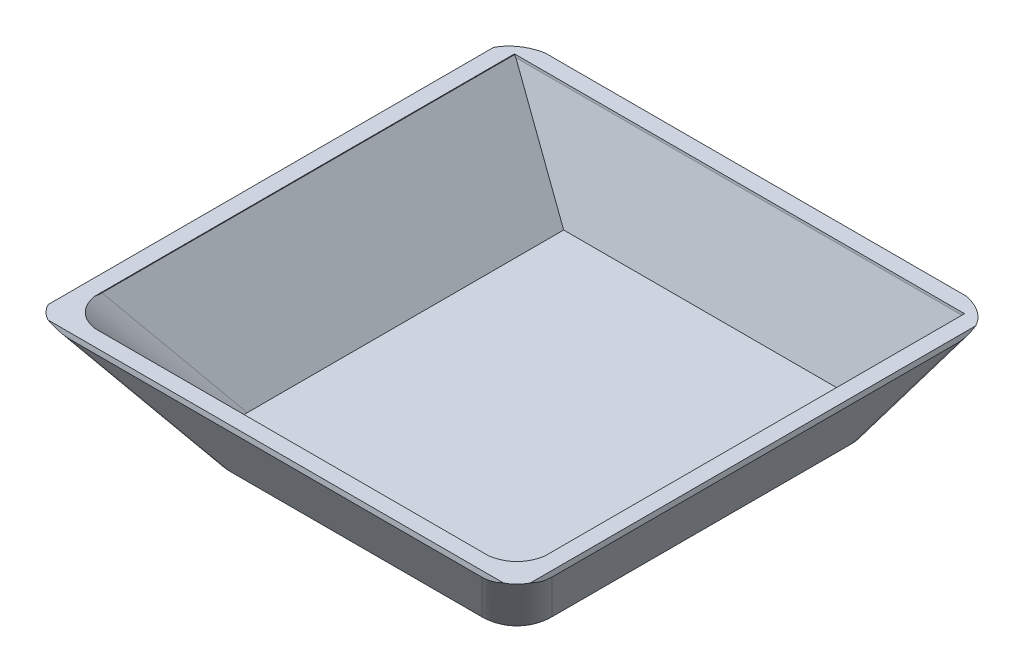
ISO-10303-21;
HEADER;
FILE_DESCRIPTION(('STEP AP214'),'2;1');
FILE_NAME('part.step','',(''),(''),'','','');
FILE_SCHEMA(('AUTOMOTIVE_DESIGN { 1 0 10303 214 1 1 1 1 }'));
ENDSEC;
DATA;
#1=APPLICATION_CONTEXT('core data for automotive mechanical design processes');
#2=APPLICATION_PROTOCOL_DEFINITION('international standard','automotive_design',2000,#1);
#3=PRODUCT_CONTEXT('',#1,'mechanical');
#4=PRODUCT('Part','Part','',(#3));
#5=PRODUCT_RELATED_PRODUCT_CATEGORY('part','',(#4));
#6=PRODUCT_DEFINITION_FORMATION('','',#4);
#7=PRODUCT_DEFINITION_CONTEXT('part definition',#1,'design');
#8=PRODUCT_DEFINITION('design','',#6,#7);
#9=PRODUCT_DEFINITION_SHAPE('','',#8);
#10=(LENGTH_UNIT() NAMED_UNIT(*) SI_UNIT(.MILLI.,.METRE.));
#11=(NAMED_UNIT(*) PLANE_ANGLE_UNIT() SI_UNIT($,.RADIAN.));
#12=(NAMED_UNIT(*) SI_UNIT($,.STERADIAN.) SOLID_ANGLE_UNIT());
#13=UNCERTAINTY_MEASURE_WITH_UNIT(LENGTH_MEASURE(1.E-05),#10,'distance_accuracy_value','');
#14=(GEOMETRIC_REPRESENTATION_CONTEXT(3) GLOBAL_UNCERTAINTY_ASSIGNED_CONTEXT((#13)) GLOBAL_UNIT_ASSIGNED_CONTEXT((#10,
#11,#12)) REPRESENTATION_CONTEXT('',''));
#15=CARTESIAN_POINT('',(0.,0.,0.));
#16=DIRECTION('',(0.,0.,1.));
#17=DIRECTION('',(1.,0.,0.));
#18=AXIS2_PLACEMENT_3D('',#15,#16,#17);
#19=CARTESIAN_POINT('',(0.,0.,0.));
#20=DIRECTION('',(0.,1.,0.));
#21=DIRECTION('',(0.,0.,1.));
#22=AXIS2_PLACEMENT_3D('',#19,#20,#21);
#23=PLANE('',#22);
#24=DIRECTION('',(0.,0.,1.));
#25=VECTOR('',#24,1.);
#26=CARTESIAN_POINT('',(-33.8077003392964,0.,-4.84582776302726));
#27=LINE('',#26,#25);
#28=CARTESIAN_POINT('',(-33.8077003392964,0.,-20.32561407749));
#29=VERTEX_POINT('',#28);
#30=CARTESIAN_POINT('',(-33.8077003392964,0.,-9.15647103388965));
#31=VERTEX_POINT('',#30);
#32=EDGE_CURVE('E272',#29,#31,#27,.T.);
#33=ORIENTED_EDGE('',*,*,#32,.T.);
#34=CARTESIAN_POINT('',(-35.7609396813148,0.,-9.7990671050456));
#35=DIRECTION('',(0.,1.,0.));
#36=DIRECTION('',(0.707106781186547,0.,0.707106781186548));
#37=AXIS2_PLACEMENT_3D('',#34,#35,#36);
#38=ELLIPSE('',#37,2.25172996924951,1.6);
#39=CARTESIAN_POINT('',(-35.1183436101588,0.,-7.84582776302727));
#40=VERTEX_POINT('',#39);
#41=EDGE_CURVE('E299',#31,#40,#38,.F.);
#42=ORIENTED_EDGE('',*,*,#41,.T.);
#43=DIRECTION('',(-1.,0.,0.));
#44=VECTOR('',#43,1.);
#45=CARTESIAN_POINT('',(0.,0.,-7.84582776302727));
#46=LINE('',#45,#44);
#47=CARTESIAN_POINT('',(-44.4970570684341,0.,-7.84582776302727));
#48=VERTEX_POINT('',#47);
#49=EDGE_CURVE('E269',#40,#48,#46,.T.);
#50=ORIENTED_EDGE('',*,*,#49,.T.);
#51=CARTESIAN_POINT('',(-43.8544609972781,0.,-9.7990671050456));
#52=DIRECTION('',(0.,1.,0.));
#53=DIRECTION('',(-0.707106781186547,0.,0.707106781186548));
#54=AXIS2_PLACEMENT_3D('',#51,#52,#53);
#55=ELLIPSE('',#54,2.25172996924951,1.6);
#56=CARTESIAN_POINT('',(-45.8077003392964,0.,-9.15647103388965));
#57=VERTEX_POINT('',#56);
#58=EDGE_CURVE('E297',#48,#57,#55,.F.);
#59=ORIENTED_EDGE('',*,*,#58,.T.);
#60=DIRECTION('',(0.,0.,1.));
#61=VECTOR('',#60,1.);
#62=CARTESIAN_POINT('',(-45.8077003392964,0.,-4.84582776302726));
#63=LINE('',#62,#61);
#64=CARTESIAN_POINT('',(-45.8077003392964,0.,-20.32561407749));
#65=VERTEX_POINT('',#64);
#66=EDGE_CURVE('E216',#65,#57,#63,.T.);
#67=ORIENTED_EDGE('',*,*,#66,.F.);
#68=CARTESIAN_POINT('',(-43.8544609972781,0.,-20.1137411905578));
#69=DIRECTION('',(0.,1.,0.));
#70=DIRECTION('',(-0.949709463562377,0.,-0.313132455711736));
#71=AXIS2_PLACEMENT_3D('',#68,#69,#70);
#72=ELLIPSE('',#71,1.98786122219148,1.6);
#73=CARTESIAN_POINT('',(-44.1064808756458,0.,-21.7558277630273));
#74=VERTEX_POINT('',#73);
#75=EDGE_CURVE('E295',#65,#74,#72,.F.);
#76=ORIENTED_EDGE('',*,*,#75,.T.);
#77=DIRECTION('',(1.,0.,0.));
#78=VECTOR('',#77,1.);
#79=CARTESIAN_POINT('',(-33.8077003392964,0.,-21.7558277630273));
#80=LINE('',#79,#78);
#81=CARTESIAN_POINT('',(-35.5089198029471,0.,-21.7558277630273));
#82=VERTEX_POINT('',#81);
#83=EDGE_CURVE('E281',#74,#82,#80,.T.);
#84=ORIENTED_EDGE('',*,*,#83,.T.);
#85=CARTESIAN_POINT('',(-35.7609396813148,0.,-20.1137411905578));
#86=DIRECTION('',(0.,1.,0.));
#87=DIRECTION('',(0.949709463562377,0.,-0.313132455711736));
#88=AXIS2_PLACEMENT_3D('',#85,#86,#87);
#89=ELLIPSE('',#88,1.98786122219148,1.6);
#90=EDGE_CURVE('E293',#82,#29,#89,.F.);
#91=ORIENTED_EDGE('',*,*,#90,.T.);
#92=EDGE_LOOP('',(#33,#42,#50,#59,#67,#76,#84,#91));
#93=FACE_BOUND('',#92,.T.);
#94=ADVANCED_FACE('F46',(#93),#23,.F.);
#95=CARTESIAN_POINT('',(-39.8077003392964,4.5,-22.7558277630273));
#96=DIRECTION('',(0.,0.,-1.));
#97=DIRECTION('',(-1.,0.,0.));
#98=AXIS2_PLACEMENT_3D('',#95,#96,#97);
#99=PLANE('',#98);
#100=DIRECTION('',(-1.,0.,0.));
#101=VECTOR('',#100,1.);
#102=CARTESIAN_POINT('',(-39.8077003392964,4.33147587428414,-22.7558277630273));
#103=LINE('',#102,#101);
#104=CARTESIAN_POINT('',(-32.4759877441998,4.33147587428414,-22.7558277630273));
#105=VERTEX_POINT('',#104);
#106=CARTESIAN_POINT('',(-47.139412934393,4.33147587428414,-22.7558277630273));
#107=VERTEX_POINT('',#106);
#108=EDGE_CURVE('E284',#105,#107,#103,.T.);
#109=ORIENTED_EDGE('',*,*,#108,.T.);
#110=CARTESIAN_POINT('',(-51.8677300649063,11.4441342464214,-22.7558277630273));
#111=DIRECTION('',(0.,0.,-1.));
#112=DIRECTION('',(-0.573576436351047,0.819152044288991,0.));
#113=AXIS2_PLACEMENT_3D('',#110,#111,#112);
#114=ELLIPSE('',#113,8.61037292534736,1.6);
#115=CARTESIAN_POINT('',(-47.6705768892428,4.5,-22.7558277630273));
#116=VERTEX_POINT('',#115);
#117=EDGE_CURVE('E337',#107,#116,#114,.T.);
#118=ORIENTED_EDGE('',*,*,#117,.T.);
#119=DIRECTION('',(1.,0.,0.));
#120=VECTOR('',#119,1.);
#121=CARTESIAN_POINT('',(-39.8077003392964,4.5,-22.7558277630273));
#122=LINE('',#121,#120);
#123=CARTESIAN_POINT('',(-31.9448237893501,4.5,-22.7558277630273));
#124=VERTEX_POINT('',#123);
#125=EDGE_CURVE('E266',#116,#124,#122,.T.);
#126=ORIENTED_EDGE('',*,*,#125,.T.);
#127=CARTESIAN_POINT('',(-27.7476706136866,11.4441342464214,-22.7558277630273));
#128=DIRECTION('',(0.,0.,-1.));
#129=DIRECTION('',(0.573576436351047,0.819152044288991,0.));
#130=AXIS2_PLACEMENT_3D('',#127,#128,#129);
#131=ELLIPSE('',#130,8.61037292534736,1.6);
#132=EDGE_CURVE('E335',#124,#105,#131,.T.);
#133=ORIENTED_EDGE('',*,*,#132,.T.);
#134=EDGE_LOOP('',(#109,#118,#126,#133));
#135=FACE_BOUND('',#134,.T.);
#136=ADVANCED_FACE('F392',(#135),#99,.T.);
#137=CARTESIAN_POINT('',(-30.8077003392964,4.5,-22.7558277630273));
#138=DIRECTION('',(1.,0.,0.));
#139=DIRECTION('',(0.,0.,-1.));
#140=AXIS2_PLACEMENT_3D('',#137,#138,#139);
#141=PLANE('',#140);
#142=DIRECTION('',(0.,0.,1.));
#143=VECTOR('',#142,1.);
#144=CARTESIAN_POINT('',(-30.8077003392964,4.5,-22.7558277630273));
#145=LINE('',#144,#143);
#146=CARTESIAN_POINT('',(-30.8077003392964,4.5,-21.9758095647512));
#147=VERTEX_POINT('',#146);
#148=CARTESIAN_POINT('',(-30.8077003392964,4.5,-5.34421632265923));
#149=VERTEX_POINT('',#148);
#150=EDGE_CURVE('E263',#147,#149,#145,.T.);
#151=ORIENTED_EDGE('',*,*,#150,.T.);
#152=CARTESIAN_POINT('',(-30.8077003392964,7.0739588932201,-4.84582776302726));
#153=DIRECTION('',(1.,0.,0.));
#154=DIRECTION('',(0.,0.819152044288991,0.573576436351047));
#155=AXIS2_PLACEMENT_3D('',#152,#153,#154);
#156=ELLIPSE('',#155,3.21580366730517,1.6);
#157=CARTESIAN_POINT('',(-30.8077003392964,4.28444402022634,-6.15647103388965));
#158=VERTEX_POINT('',#157);
#159=EDGE_CURVE('E320',#149,#158,#156,.T.);
#160=ORIENTED_EDGE('',*,*,#159,.T.);
#161=DIRECTION('',(0.,0.,-1.));
#162=VECTOR('',#161,1.);
#163=CARTESIAN_POINT('',(-30.8077003392964,4.28444402022634,-22.7558277630273));
#164=LINE('',#163,#162);
#165=CARTESIAN_POINT('',(-30.8077003392964,4.28444402022634,-21.3147559184184));
#166=VERTEX_POINT('',#165);
#167=EDGE_CURVE('E275',#158,#166,#164,.T.);
#168=ORIENTED_EDGE('',*,*,#167,.T.);
#169=CARTESIAN_POINT('',(-30.8077003392964,7.0739588932201,-21.7468932843322));
#170=DIRECTION('',(1.,0.,0.));
#171=DIRECTION('',(0.,0.974370064785235,-0.224951054343866));
#172=AXIS2_PLACEMENT_3D('',#169,#170,#171);
#173=ELLIPSE('',#172,2.8389600421527,1.6);
#174=EDGE_CURVE('E318',#166,#147,#173,.T.);
#175=ORIENTED_EDGE('',*,*,#174,.T.);
#176=EDGE_LOOP('',(#151,#160,#168,#175));
#177=FACE_BOUND('',#176,.T.);
#178=ADVANCED_FACE('F398',(#177),#141,.T.);
#179=CARTESIAN_POINT('',(-39.8077003392964,4.5,-4.84582776302726));
#180=DIRECTION('',(0.,0.,-1.));
#181=DIRECTION('',(-1.,0.,0.));
#182=AXIS2_PLACEMENT_3D('',#179,#180,#181);
#183=PLANE('',#182);
#184=DIRECTION('',(1.,0.,0.));
#185=VECTOR('',#184,1.);
#186=CARTESIAN_POINT('',(-39.8077003392964,4.28444402022634,-4.84582776302726));
#187=LINE('',#186,#185);
#188=CARTESIAN_POINT('',(-47.4970570684341,4.28444402022634,-4.84582776302726));
#189=VERTEX_POINT('',#188);
#190=CARTESIAN_POINT('',(-32.1183436101588,4.28444402022634,-4.84582776302726));
#191=VERTEX_POINT('',#190);
#192=EDGE_CURVE('E278',#189,#191,#187,.T.);
#193=ORIENTED_EDGE('',*,*,#192,.T.);
#194=CARTESIAN_POINT('',(-30.8077003392964,7.07395889322009,-4.84582776302726));
#195=DIRECTION('',(0.,0.,-1.));
#196=DIRECTION('',(0.573576436351047,0.819152044288991,0.));
#197=AXIS2_PLACEMENT_3D('',#194,#195,#196);
#198=ELLIPSE('',#197,3.21580366730517,1.6);
#199=CARTESIAN_POINT('',(-31.3060888989284,4.5,-4.84582776302726));
#200=VERTEX_POINT('',#199);
#201=EDGE_CURVE('E308',#191,#200,#198,.F.);
#202=ORIENTED_EDGE('',*,*,#201,.T.);
#203=DIRECTION('',(1.,0.,0.));
#204=VECTOR('',#203,1.);
#205=CARTESIAN_POINT('',(-39.8077003392964,4.5,-4.84582776302726));
#206=LINE('',#205,#204);
#207=CARTESIAN_POINT('',(-48.3093117796645,4.5,-4.84582776302726));
#208=VERTEX_POINT('',#207);
#209=EDGE_CURVE('E260',#208,#200,#206,.T.);
#210=ORIENTED_EDGE('',*,*,#209,.F.);
#211=CARTESIAN_POINT('',(-48.8077003392964,7.07395889322009,-4.84582776302726));
#212=DIRECTION('',(0.,0.,-1.));
#213=DIRECTION('',(-0.573576436351047,0.819152044288991,0.));
#214=AXIS2_PLACEMENT_3D('',#211,#212,#213);
#215=ELLIPSE('',#214,3.21580366730517,1.6);
#216=EDGE_CURVE('E306',#208,#189,#215,.F.);
#217=ORIENTED_EDGE('',*,*,#216,.T.);
#218=EDGE_LOOP('',(#193,#202,#210,#217));
#219=FACE_BOUND('',#218,.T.);
#220=ADVANCED_FACE('F403',(#219),#183,.F.);
#221=CARTESIAN_POINT('',(0.,4.5,0.));
#222=DIRECTION('',(0.,-1.,0.));
#223=DIRECTION('',(0.,0.,-1.));
#224=AXIS2_PLACEMENT_3D('',#221,#222,#223);
#225=PLANE('',#224);
#226=ORIENTED_EDGE('',*,*,#209,.T.);
#227=CARTESIAN_POINT('',(-32.6100057593711,4.5,-6.6481331831019));
#228=DIRECTION('',(0.,-1.,0.));
#229=DIRECTION('',(0.707106781186547,0.,0.707106781186548));
#230=AXIS2_PLACEMENT_3D('',#227,#228,#229);
#231=ELLIPSE('',#230,2.25172996924951,1.6);
#232=EDGE_CURVE('E316',#200,#149,#231,.F.);
#233=ORIENTED_EDGE('',*,*,#232,.T.);
#234=ORIENTED_EDGE('',*,*,#150,.F.);
#235=CARTESIAN_POINT('',(-32.6100057593711,4.5,-21.1526480506229));
#236=DIRECTION('',(0.,-1.,0.));
#237=DIRECTION('',(0.949709463562377,0.,-0.313132455711736));
#238=AXIS2_PLACEMENT_3D('',#235,#236,#237);
#239=ELLIPSE('',#238,1.98786122219148,1.6);
#240=EDGE_CURVE('E310',#147,#124,#239,.F.);
#241=ORIENTED_EDGE('',*,*,#240,.T.);
#242=ORIENTED_EDGE('',*,*,#125,.F.);
#243=CARTESIAN_POINT('',(-47.0053949192218,4.5,-21.1526480506229));
#244=DIRECTION('',(0.,-1.,0.));
#245=DIRECTION('',(-0.949709463562377,0.,-0.313132455711736));
#246=AXIS2_PLACEMENT_3D('',#243,#244,#245);
#247=ELLIPSE('',#246,1.98786122219148,1.6);
#248=CARTESIAN_POINT('',(-48.8077003392964,4.5,-21.9758095647512));
#249=VERTEX_POINT('',#248);
#250=EDGE_CURVE('E312',#116,#249,#247,.F.);
#251=ORIENTED_EDGE('',*,*,#250,.T.);
#252=DIRECTION('',(0.,0.,1.));
#253=VECTOR('',#252,1.);
#254=CARTESIAN_POINT('',(-48.8077003392964,4.5,-22.7558277630273));
#255=LINE('',#254,#253);
#256=CARTESIAN_POINT('',(-48.8077003392964,4.5,-5.3442163226592));
#257=VERTEX_POINT('',#256);
#258=EDGE_CURVE('E727',#249,#257,#255,.T.);
#259=ORIENTED_EDGE('',*,*,#258,.T.);
#260=CARTESIAN_POINT('',(-47.0053949192218,4.5,-6.6481331831019));
#261=DIRECTION('',(0.,-1.,0.));
#262=DIRECTION('',(-0.707106781186547,0.,0.707106781186548));
#263=AXIS2_PLACEMENT_3D('',#260,#261,#262);
#264=ELLIPSE('',#263,2.25172996924951,1.6);
#265=EDGE_CURVE('E314',#257,#208,#264,.F.);
#266=ORIENTED_EDGE('',*,*,#265,.T.);
#267=EDGE_LOOP('',(#226,#233,#234,#241,#242,#251,#259,#266));
#268=FACE_BOUND('',#267,.T.);
#269=DIRECTION('',(1.,0.,0.));
#270=VECTOR('',#269,1.);
#271=CARTESIAN_POINT('',(0.,4.5,-5.44582776302726));
#272=LINE('',#271,#270);
#273=CARTESIAN_POINT('',(-47.1625037701931,4.5,-5.44582776302726));
#274=VERTEX_POINT('',#273);
#275=CARTESIAN_POINT('',(-32.4528969083996,4.5,-5.44582776302726));
#276=VERTEX_POINT('',#275);
#277=EDGE_CURVE('E235',#274,#276,#272,.T.);
#278=ORIENTED_EDGE('',*,*,#277,.F.);
#279=CARTESIAN_POINT('',(-46.2729301659649,4.5,-7.38059793635877));
#280=DIRECTION('',(0.,-1.,0.));
#281=DIRECTION('',(0.707106781186547,0.,-0.707106781186548));
#282=AXIS2_PLACEMENT_3D('',#279,#280,#281);
#283=ELLIPSE('',#282,2.25172996924951,1.6);
#284=CARTESIAN_POINT('',(-48.2077003392964,4.5,-6.49102433213043));
#285=VERTEX_POINT('',#284);
#286=EDGE_CURVE('E54',#274,#285,#283,.T.);
#287=ORIENTED_EDGE('',*,*,#286,.T.);
#288=DIRECTION('',(0.,0.,1.));
#289=VECTOR('',#288,1.);
#290=CARTESIAN_POINT('',(-48.2077003392964,4.5,0.));
#291=LINE('',#290,#289);
#292=CARTESIAN_POINT('',(-48.2077003392964,4.5,-22.1558277630273));
#293=VERTEX_POINT('',#292);
#294=EDGE_CURVE('E230',#293,#285,#291,.T.);
#295=ORIENTED_EDGE('',*,*,#294,.F.);
#296=DIRECTION('',(1.,0.,0.));
#297=VECTOR('',#296,1.);
#298=CARTESIAN_POINT('',(0.,4.5,-22.1558277630273));
#299=LINE('',#298,#297);
#300=CARTESIAN_POINT('',(-31.4077003392964,4.5,-22.1558277630273));
#301=VERTEX_POINT('',#300);
#302=EDGE_CURVE('E248',#293,#301,#299,.T.);
#303=ORIENTED_EDGE('',*,*,#302,.T.);
#304=DIRECTION('',(0.,0.,1.));
#305=VECTOR('',#304,1.);
#306=CARTESIAN_POINT('',(-31.4077003392964,4.5,0.));
#307=LINE('',#306,#305);
#308=CARTESIAN_POINT('',(-31.4077003392964,4.5,-6.4910243321304));
#309=VERTEX_POINT('',#308);
#310=EDGE_CURVE('E254',#301,#309,#307,.T.);
#311=ORIENTED_EDGE('',*,*,#310,.T.);
#312=CARTESIAN_POINT('',(-33.3424705126279,4.5,-7.38059793635877));
#313=DIRECTION('',(0.,-1.,0.));
#314=DIRECTION('',(-0.707106781186547,0.,-0.707106781186548));
#315=AXIS2_PLACEMENT_3D('',#312,#313,#314);
#316=ELLIPSE('',#315,2.25172996924951,1.6);
#317=EDGE_CURVE('E11',#309,#276,#316,.T.);
#318=ORIENTED_EDGE('',*,*,#317,.T.);
#319=EDGE_LOOP('',(#278,#287,#295,#303,#311,#318));
#320=FACE_BOUND('',#319,.T.);
#321=ADVANCED_FACE('F360',(#268,#320),#225,.F.);
#322=CARTESIAN_POINT('',(-39.8077003392964,4.28444402022634,-4.84582776302726));
#323=DIRECTION('',(0.,0.573576436351047,-0.819152044288991));
#324=DIRECTION('',(1.,0.,0.));
#325=AXIS2_PLACEMENT_3D('',#322,#323,#324);
#326=PLANE('',#325);
#327=ORIENTED_EDGE('',*,*,#49,.F.);
#328=DIRECTION('',(-0.497542812164524,-0.710564775461629,-0.497542812164524));
#329=VECTOR('',#328,1.);
#330=CARTESIAN_POINT('',(-34.021835025209,1.56597654997177,-6.7493191780774));
#331=LINE('',#330,#329);
#332=EDGE_CURVE('E304',#40,#191,#331,.F.);
#333=ORIENTED_EDGE('',*,*,#332,.T.);
#334=ORIENTED_EDGE('',*,*,#192,.F.);
#335=DIRECTION('',(0.497542812164524,-0.710564775461629,-0.497542812164524));
#336=VECTOR('',#335,1.);
#337=CARTESIAN_POINT('',(-45.5935656533839,1.56597654997177,-6.7493191780774));
#338=LINE('',#337,#336);
#339=EDGE_CURVE('E301',#189,#48,#338,.T.);
#340=ORIENTED_EDGE('',*,*,#339,.T.);
#341=EDGE_LOOP('',(#327,#333,#334,#340));
#342=FACE_BOUND('',#341,.T.);
#343=ADVANCED_FACE('F414',(#342),#326,.F.);
#344=CARTESIAN_POINT('',(-33.8077003392964,0.,0.));
#345=DIRECTION('',(0.819152044288991,-0.573576436351047,0.));
#346=DIRECTION('',(0.,0.,-1.));
#347=AXIS2_PLACEMENT_3D('',#344,#345,#346);
#348=PLANE('',#347);
#349=ORIENTED_EDGE('',*,*,#167,.F.);
#350=DIRECTION('',(0.497542812164523,0.710564775461629,0.497542812164524));
#351=VECTOR('',#350,1.);
#352=CARTESIAN_POINT('',(-31.5410264653794,3.237145774969,-6.88979715997264));
#353=LINE('',#352,#351);
#354=EDGE_CURVE('E290',#158,#31,#353,.F.);
#355=ORIENTED_EDGE('',*,*,#354,.T.);
#356=ORIENTED_EDGE('',*,*,#32,.F.);
#357=DIRECTION('',(0.563586657171395,0.804885161065777,-0.185822381199064));
#358=VECTOR('',#357,1.);
#359=CARTESIAN_POINT('',(-35.9363412225114,-3.0400142344332,-19.6237714901905));
#360=LINE('',#359,#358);
#361=EDGE_CURVE('E287',#29,#166,#360,.T.);
#362=ORIENTED_EDGE('',*,*,#361,.T.);
#363=EDGE_LOOP('',(#349,#355,#356,#362));
#364=FACE_BOUND('',#363,.T.);
#365=ADVANCED_FACE('F406',(#364),#348,.T.);
#366=CARTESIAN_POINT('',(0.,0.,-21.7558277630273));
#367=DIRECTION('',(0.,-0.224951054343866,-0.974370064785235));
#368=DIRECTION('',(-1.,0.,0.));
#369=AXIS2_PLACEMENT_3D('',#366,#367,#368);
#370=PLANE('',#369);
#371=ORIENTED_EDGE('',*,*,#83,.F.);
#372=DIRECTION('',(-0.563586657171395,0.804885161065778,-0.185822381199064));
#373=VECTOR('',#372,1.);
#374=CARTESIAN_POINT('',(-30.0969428773862,-20.0076937675923,-17.136687694309));
#375=LINE('',#374,#373);
#376=EDGE_CURVE('E332',#74,#107,#375,.T.);
#377=ORIENTED_EDGE('',*,*,#376,.T.);
#378=ORIENTED_EDGE('',*,*,#108,.F.);
#379=DIRECTION('',(0.563586657171395,0.804885161065778,-0.185822381199064));
#380=VECTOR('',#379,1.);
#381=CARTESIAN_POINT('',(-24.2302244416216,16.1076462989286,-25.4745709273513));
#382=LINE('',#381,#380);
#383=EDGE_CURVE('E330',#105,#82,#382,.F.);
#384=ORIENTED_EDGE('',*,*,#383,.T.);
#385=EDGE_LOOP('',(#371,#377,#378,#384));
#386=FACE_BOUND('',#385,.T.);
#387=ADVANCED_FACE('F413',(#386),#370,.T.);
#388=CARTESIAN_POINT('',(0.,0.6,0.));
#389=DIRECTION('',(0.,1.,0.));
#390=DIRECTION('',(0.,0.,1.));
#391=AXIS2_PLACEMENT_3D('',#388,#389,#390);
#392=PLANE('',#391);
#393=DIRECTION('',(0.,0.,1.));
#394=VECTOR('',#393,1.);
#395=CARTESIAN_POINT('',(-45.4953601089654,0.6,0.));
#396=LINE('',#395,#394);
#397=CARTESIAN_POINT('',(-45.4953601089654,0.6,-21.2785662130266));
#398=VERTEX_POINT('',#397);
#399=CARTESIAN_POINT('',(-45.4953601089654,0.6,-9.4688112642207));
#400=VERTEX_POINT('',#399);
#401=EDGE_CURVE('E201',#398,#400,#396,.T.);
#402=ORIENTED_EDGE('',*,*,#401,.T.);
#403=CARTESIAN_POINT('',(-43.5421207669471,0.6,-10.1114073353766));
#404=DIRECTION('',(0.,1.,0.));
#405=DIRECTION('',(0.707106781186547,0.,-0.707106781186548));
#406=AXIS2_PLACEMENT_3D('',#403,#404,#405);
#407=ELLIPSE('',#406,2.25172996924951,1.6);
#408=CARTESIAN_POINT('',(-44.184716838103,0.6,-8.15816799335831));
#409=VERTEX_POINT('',#408);
#410=EDGE_CURVE('E342',#400,#409,#407,.T.);
#411=ORIENTED_EDGE('',*,*,#410,.T.);
#412=DIRECTION('',(1.,0.,0.));
#413=VECTOR('',#412,1.);
#414=CARTESIAN_POINT('',(-39.8077003392964,0.6,-8.15816799335831));
#415=LINE('',#414,#413);
#416=CARTESIAN_POINT('',(-35.4306838404899,0.6,-8.15816799335831));
#417=VERTEX_POINT('',#416);
#418=EDGE_CURVE('E239',#417,#409,#415,.F.);
#419=ORIENTED_EDGE('',*,*,#418,.F.);
#420=CARTESIAN_POINT('',(-36.0732799116458,0.6,-10.1114073353766));
#421=DIRECTION('',(0.,1.,0.));
#422=DIRECTION('',(-0.707106781186547,0.,-0.707106781186548));
#423=AXIS2_PLACEMENT_3D('',#420,#421,#422);
#424=ELLIPSE('',#423,2.25172996924951,1.6);
#425=CARTESIAN_POINT('',(-34.1200405696275,0.6,-9.4688112642207));
#426=VERTEX_POINT('',#425);
#427=EDGE_CURVE('E340',#417,#426,#424,.T.);
#428=ORIENTED_EDGE('',*,*,#427,.T.);
#429=DIRECTION('',(0.,0.,1.));
#430=VECTOR('',#429,1.);
#431=CARTESIAN_POINT('',(-34.1200405696275,0.6,0.));
#432=LINE('',#431,#430);
#433=CARTESIAN_POINT('',(-34.1200405696275,0.6,-21.2785662130266));
#434=VERTEX_POINT('',#433);
#435=EDGE_CURVE('E202',#434,#426,#432,.T.);
#436=ORIENTED_EDGE('',*,*,#435,.F.);
#437=DIRECTION('',(1.,0.,0.));
#438=VECTOR('',#437,1.);
#439=CARTESIAN_POINT('',(0.,0.6,-21.2785662130266));
#440=LINE('',#439,#438);
#441=EDGE_CURVE('E197',#398,#434,#440,.T.);
#442=ORIENTED_EDGE('',*,*,#441,.F.);
#443=EDGE_LOOP('',(#402,#411,#419,#428,#436,#442));
#444=FACE_BOUND('',#443,.T.);
#445=ADVANCED_FACE('F199',(#444),#392,.T.);
#446=CARTESIAN_POINT('',(-39.8077003392964,4.5,-22.1558277630273));
#447=DIRECTION('',(0.,0.,-1.));
#448=DIRECTION('',(-1.,0.,0.));
#449=AXIS2_PLACEMENT_3D('',#446,#447,#448);
#450=PLANE('',#449);
#451=DIRECTION('',(0.573576436351047,0.819152044288991,0.));
#452=VECTOR('',#451,1.);
#453=CARTESIAN_POINT('',(-34.2991915658698,0.344145861810628,-22.1558277630273));
#454=LINE('',#453,#452);
#455=CARTESIAN_POINT('',(-31.4593658907241,4.39983723926513,-22.1558277630273));
#456=VERTEX_POINT('',#455);
#457=CARTESIAN_POINT('',(-31.4077003392964,4.47362329355373,-22.1558277630273));
#458=VERTEX_POINT('',#457);
#459=EDGE_CURVE('E250',#456,#458,#454,.T.);
#460=ORIENTED_EDGE('',*,*,#459,.T.);
#461=DIRECTION('',(0.,-1.,0.));
#462=VECTOR('',#461,1.);
#463=CARTESIAN_POINT('',(-31.4077003392964,4.5,-22.1558277630273));
#464=LINE('',#463,#462);
#465=EDGE_CURVE('E242',#301,#458,#464,.T.);
#466=ORIENTED_EDGE('',*,*,#465,.F.);
#467=ORIENTED_EDGE('',*,*,#302,.F.);
#468=DIRECTION('',(0.,-1.,0.));
#469=VECTOR('',#468,1.);
#470=CARTESIAN_POINT('',(-48.2077003392964,4.5,-22.1558277630273));
#471=LINE('',#470,#469);
#472=CARTESIAN_POINT('',(-48.2077003392964,4.47362329355373,-22.1558277630273));
#473=VERTEX_POINT('',#472);
#474=EDGE_CURVE('E233',#293,#473,#471,.T.);
#475=ORIENTED_EDGE('',*,*,#474,.T.);
#476=DIRECTION('',(-0.573576436351047,0.819152044288991,0.));
#477=VECTOR('',#476,1.);
#478=CARTESIAN_POINT('',(-45.316209112723,0.344145861810628,-22.1558277630273));
#479=LINE('',#478,#477);
#480=CARTESIAN_POINT('',(-48.1560347878688,4.39983723926513,-22.1558277630273));
#481=VERTEX_POINT('',#480);
#482=EDGE_CURVE('E225',#481,#473,#479,.T.);
#483=ORIENTED_EDGE('',*,*,#482,.F.);
#484=DIRECTION('',(-1.,0.,0.));
#485=VECTOR('',#484,1.);
#486=CARTESIAN_POINT('',(-39.8077003392964,4.39983723926513,-22.1558277630273));
#487=LINE('',#486,#485);
#488=EDGE_CURVE('E212',#456,#481,#487,.T.);
#489=ORIENTED_EDGE('',*,*,#488,.F.);
#490=EDGE_LOOP('',(#460,#466,#467,#475,#483,#489));
#491=FACE_BOUND('',#490,.T.);
#492=ADVANCED_FACE('F379',(#491),#450,.F.);
#493=CARTESIAN_POINT('',(-31.4077003392964,4.5,-22.7558277630273));
#494=DIRECTION('',(1.,0.,0.));
#495=DIRECTION('',(0.,0.,-1.));
#496=AXIS2_PLACEMENT_3D('',#493,#494,#495);
#497=PLANE('',#496);
#498=DIRECTION('',(0.,0.,-1.));
#499=VECTOR('',#498,1.);
#500=CARTESIAN_POINT('',(-31.4077003392964,4.47362329355373,-22.7558277630273));
#501=LINE('',#500,#499);
#502=CARTESIAN_POINT('',(-31.4077003392964,4.47362329355373,-6.75647103388965));
#503=VERTEX_POINT('',#502);
#504=EDGE_CURVE('E238',#503,#458,#501,.T.);
#505=ORIENTED_EDGE('',*,*,#504,.F.);
#506=CARTESIAN_POINT('',(-31.4077003392964,7.26313816654748,-5.44582776302727));
#507=DIRECTION('',(1.,0.,0.));
#508=DIRECTION('',(0.,-0.819152044288991,-0.573576436351047));
#509=AXIS2_PLACEMENT_3D('',#506,#507,#508);
#510=ELLIPSE('',#509,3.21580366730517,1.6);
#511=EDGE_CURVE('E61',#503,#309,#510,.F.);
#512=ORIENTED_EDGE('',*,*,#511,.T.);
#513=ORIENTED_EDGE('',*,*,#310,.F.);
#514=ORIENTED_EDGE('',*,*,#465,.T.);
#515=EDGE_LOOP('',(#505,#512,#513,#514));
#516=FACE_BOUND('',#515,.T.);
#517=ADVANCED_FACE('F380',(#516),#497,.F.);
#518=CARTESIAN_POINT('',(-39.8077003392964,4.5,-5.44582776302726));
#519=DIRECTION('',(0.,0.,-1.));
#520=DIRECTION('',(-1.,0.,0.));
#521=AXIS2_PLACEMENT_3D('',#518,#519,#520);
#522=PLANE('',#521);
#523=DIRECTION('',(-1.,0.,0.));
#524=VECTOR('',#523,1.);
#525=CARTESIAN_POINT('',(-39.8077003392964,4.47362329355373,-5.44582776302726));
#526=LINE('',#525,#524);
#527=CARTESIAN_POINT('',(-46.8970570684341,4.47362329355373,-5.44582776302726));
#528=VERTEX_POINT('',#527);
#529=CARTESIAN_POINT('',(-32.7183436101588,4.47362329355373,-5.44582776302726));
#530=VERTEX_POINT('',#529);
#531=EDGE_CURVE('E206',#528,#530,#526,.F.);
#532=ORIENTED_EDGE('',*,*,#531,.F.);
#533=CARTESIAN_POINT('',(-48.2077003392964,7.26313816654749,-5.44582776302726));
#534=DIRECTION('',(0.,0.,-1.));
#535=DIRECTION('',(0.573576436351047,-0.819152044288991,0.));
#536=AXIS2_PLACEMENT_3D('',#533,#534,#535);
#537=ELLIPSE('',#536,3.21580366730517,1.6);
#538=EDGE_CURVE('E351',#528,#274,#537,.T.);
#539=ORIENTED_EDGE('',*,*,#538,.T.);
#540=ORIENTED_EDGE('',*,*,#277,.T.);
#541=CARTESIAN_POINT('',(-31.4077003392964,7.26313816654749,-5.44582776302726));
#542=DIRECTION('',(0.,0.,-1.));
#543=DIRECTION('',(-0.573576436351047,-0.819152044288991,0.));
#544=AXIS2_PLACEMENT_3D('',#541,#542,#543);
#545=ELLIPSE('',#544,3.21580366730517,1.6);
#546=EDGE_CURVE('E349',#276,#530,#545,.T.);
#547=ORIENTED_EDGE('',*,*,#546,.T.);
#548=EDGE_LOOP('',(#532,#539,#540,#547));
#549=FACE_BOUND('',#548,.T.);
#550=ADVANCED_FACE('F382',(#549),#522,.T.);
#551=CARTESIAN_POINT('',(-39.8077003392964,4.62858988203697,-5.33731898960066));
#552=DIRECTION('',(0.,0.573576436351047,-0.819152044288991));
#553=DIRECTION('',(1.,0.,0.));
#554=AXIS2_PLACEMENT_3D('',#551,#552,#553);
#555=PLANE('',#554);
#556=ORIENTED_EDGE('',*,*,#418,.T.);
#557=DIRECTION('',(0.497542812164524,-0.710564775461629,-0.497542812164524));
#558=VECTOR('',#557,1.);
#559=CARTESIAN_POINT('',(-47.2215053028132,4.93698339277324,-5.12137952864816));
#560=LINE('',#559,#558);
#561=EDGE_CURVE('E347',#409,#528,#560,.F.);
#562=ORIENTED_EDGE('',*,*,#561,.T.);
#563=ORIENTED_EDGE('',*,*,#531,.T.);
#564=DIRECTION('',(-0.497542812164524,-0.710564775461629,-0.497542812164524));
#565=VECTOR('',#564,1.);
#566=CARTESIAN_POINT('',(-35.1062356061108,1.06336009921952,-7.83371975897921));
#567=LINE('',#566,#565);
#568=EDGE_CURVE('E344',#530,#417,#567,.T.);
#569=ORIENTED_EDGE('',*,*,#568,.T.);
#570=EDGE_LOOP('',(#556,#562,#563,#569));
#571=FACE_BOUND('',#570,.T.);
#572=ADVANCED_FACE('F371',(#571),#555,.T.);
#573=CARTESIAN_POINT('',(-34.2991915658698,0.344145861810628,0.));
#574=DIRECTION('',(0.819152044288991,-0.573576436351047,0.));
#575=DIRECTION('',(0.,0.,-1.));
#576=AXIS2_PLACEMENT_3D('',#573,#574,#575);
#577=PLANE('',#576);
#578=ORIENTED_EDGE('',*,*,#435,.T.);
#579=DIRECTION('',(0.497542812164523,0.710564775461629,0.497542812164524));
#580=VECTOR('',#579,1.);
#581=CARTESIAN_POINT('',(-31.0832521049173,4.93698339277325,-6.43202279951055));
#582=LINE('',#581,#580);
#583=EDGE_CURVE('E69',#426,#503,#582,.T.);
#584=ORIENTED_EDGE('',*,*,#583,.T.);
#585=ORIENTED_EDGE('',*,*,#504,.T.);
#586=ORIENTED_EDGE('',*,*,#459,.F.);
#587=DIRECTION('',(0.563586657171395,0.804885161065778,-0.185822381199064));
#588=VECTOR('',#587,1.);
#589=CARTESIAN_POINT('',(-36.5214462050813,-2.82956267165268,-20.4867892826704));
#590=LINE('',#589,#588);
#591=EDGE_CURVE('E205',#434,#456,#590,.T.);
#592=ORIENTED_EDGE('',*,*,#591,.F.);
#593=EDGE_LOOP('',(#578,#584,#585,#586,#592));
#594=FACE_BOUND('',#593,.T.);
#595=ADVANCED_FACE('F377',(#594),#577,.F.);
#596=CARTESIAN_POINT('',(0.,0.13497063260632,-21.1712057241561));
#597=DIRECTION('',(0.,-0.224951054343866,-0.974370064785235));
#598=DIRECTION('',(-1.,0.,0.));
#599=AXIS2_PLACEMENT_3D('',#596,#597,#598);
#600=PLANE('',#599);
#601=ORIENTED_EDGE('',*,*,#488,.T.);
#602=DIRECTION('',(-0.563586657171395,0.804885161065778,-0.185822381199064));
#603=VECTOR('',#602,1.);
#604=CARTESIAN_POINT('',(-43.0939544735115,-2.82956267165268,-20.4867892826704));
#605=LINE('',#604,#603);
#606=EDGE_CURVE('E209',#398,#481,#605,.T.);
#607=ORIENTED_EDGE('',*,*,#606,.F.);
#608=ORIENTED_EDGE('',*,*,#441,.T.);
#609=ORIENTED_EDGE('',*,*,#591,.T.);
#610=EDGE_LOOP('',(#601,#607,#608,#609));
#611=FACE_BOUND('',#610,.T.);
#612=ADVANCED_FACE('F210',(#611),#600,.F.);
#613=CARTESIAN_POINT('',(-48.2077003392964,4.5,-22.7558277630273));
#614=DIRECTION('',(-1.,0.,0.));
#615=DIRECTION('',(0.,0.,-1.));
#616=AXIS2_PLACEMENT_3D('',#613,#614,#615);
#617=PLANE('',#616);
#618=ORIENTED_EDGE('',*,*,#294,.T.);
#619=CARTESIAN_POINT('',(-48.2077003392964,7.26313816654748,-5.44582776302726));
#620=DIRECTION('',(-1.,0.,0.));
#621=DIRECTION('',(0.,-0.819152044288991,-0.573576436351047));
#622=AXIS2_PLACEMENT_3D('',#619,#620,#621);
#623=ELLIPSE('',#622,3.21580366730517,1.6);
#624=CARTESIAN_POINT('',(-48.2077003392964,4.47362329355373,-6.75647103388965));
#625=VERTEX_POINT('',#624);
#626=EDGE_CURVE('E353',#285,#625,#623,.F.);
#627=ORIENTED_EDGE('',*,*,#626,.T.);
#628=DIRECTION('',(0.,0.,-1.));
#629=VECTOR('',#628,1.);
#630=CARTESIAN_POINT('',(-48.2077003392964,4.47362329355373,-22.7558277630273));
#631=LINE('',#630,#629);
#632=EDGE_CURVE('E223',#625,#473,#631,.T.);
#633=ORIENTED_EDGE('',*,*,#632,.T.);
#634=ORIENTED_EDGE('',*,*,#474,.F.);
#635=EDGE_LOOP('',(#618,#627,#633,#634));
#636=FACE_BOUND('',#635,.T.);
#637=ADVANCED_FACE('F366',(#636),#617,.F.);
#638=CARTESIAN_POINT('',(-45.316209112723,0.344145861810628,0.));
#639=DIRECTION('',(-0.819152044288991,-0.573576436351047,0.));
#640=DIRECTION('',(0.,0.,-1.));
#641=AXIS2_PLACEMENT_3D('',#638,#639,#640);
#642=PLANE('',#641);
#643=ORIENTED_EDGE('',*,*,#632,.F.);
#644=DIRECTION('',(-0.497542812164523,0.710564775461629,0.497542812164524));
#645=VECTOR('',#644,1.);
#646=CARTESIAN_POINT('',(-45.8198083433445,1.06336009921952,-9.1443630298416));
#647=LINE('',#646,#645);
#648=EDGE_CURVE('E222',#625,#400,#647,.F.);
#649=ORIENTED_EDGE('',*,*,#648,.T.);
#650=ORIENTED_EDGE('',*,*,#401,.F.);
#651=ORIENTED_EDGE('',*,*,#606,.T.);
#652=ORIENTED_EDGE('',*,*,#482,.T.);
#653=EDGE_LOOP('',(#643,#649,#650,#651,#652));
#654=FACE_BOUND('',#653,.T.);
#655=ADVANCED_FACE('F220',(#654),#642,.F.);
#656=CARTESIAN_POINT('',(-45.8077003392964,0.,0.));
#657=DIRECTION('',(-0.819152044288991,-0.573576436351047,0.));
#658=DIRECTION('',(0.,0.,-1.));
#659=AXIS2_PLACEMENT_3D('',#656,#657,#658);
#660=PLANE('',#659);
#661=ORIENTED_EDGE('',*,*,#66,.T.);
#662=DIRECTION('',(-0.497542812164523,0.710564775461629,0.497542812164524));
#663=VECTOR('',#662,1.);
#664=CARTESIAN_POINT('',(-48.0743742132135,3.237145774969,-6.88979715997264));
#665=LINE('',#664,#663);
#666=CARTESIAN_POINT('',(-48.8077003392964,4.28444402022634,-6.15647103388965));
#667=VERTEX_POINT('',#666);
#668=EDGE_CURVE('E324',#57,#667,#665,.T.);
#669=ORIENTED_EDGE('',*,*,#668,.T.);
#670=DIRECTION('',(0.,0.,-1.));
#671=VECTOR('',#670,1.);
#672=CARTESIAN_POINT('',(-48.8077003392964,4.28444402022634,-22.7558277630273));
#673=LINE('',#672,#671);
#674=CARTESIAN_POINT('',(-48.8077003392964,4.28444402022634,-21.3147559184184));
#675=VERTEX_POINT('',#674);
#676=EDGE_CURVE('E732',#667,#675,#673,.T.);
#677=ORIENTED_EDGE('',*,*,#676,.T.);
#678=DIRECTION('',(-0.563586657171395,0.804885161065777,-0.185822381199064));
#679=VECTOR('',#678,1.);
#680=CARTESIAN_POINT('',(-43.6790594560815,-3.0400142344332,-19.6237714901904));
#681=LINE('',#680,#679);
#682=EDGE_CURVE('E322',#675,#65,#681,.F.);
#683=ORIENTED_EDGE('',*,*,#682,.T.);
#684=EDGE_LOOP('',(#661,#669,#677,#683));
#685=FACE_BOUND('',#684,.T.);
#686=ADVANCED_FACE('F462',(#685),#660,.T.);
#687=CARTESIAN_POINT('',(-48.8077003392964,4.5,-22.7558277630273));
#688=DIRECTION('',(-1.,0.,0.));
#689=DIRECTION('',(0.,0.,-1.));
#690=AXIS2_PLACEMENT_3D('',#687,#688,#689);
#691=PLANE('',#690);
#692=ORIENTED_EDGE('',*,*,#676,.F.);
#693=CARTESIAN_POINT('',(-48.8077003392964,7.07395889322009,-4.84582776302726));
#694=DIRECTION('',(-1.,0.,0.));
#695=DIRECTION('',(0.,0.819152044288991,0.573576436351047));
#696=AXIS2_PLACEMENT_3D('',#693,#694,#695);
#697=ELLIPSE('',#696,3.21580366730517,1.6);
#698=EDGE_CURVE('E328',#667,#257,#697,.T.);
#699=ORIENTED_EDGE('',*,*,#698,.T.);
#700=ORIENTED_EDGE('',*,*,#258,.F.);
#701=CARTESIAN_POINT('',(-48.8077003392964,7.0739588932201,-21.7468932843322));
#702=DIRECTION('',(-1.,0.,0.));
#703=DIRECTION('',(0.,0.974370064785235,-0.224951054343866));
#704=AXIS2_PLACEMENT_3D('',#701,#702,#703);
#705=ELLIPSE('',#704,2.8389600421527,1.6);
#706=EDGE_CURVE('E326',#249,#675,#705,.T.);
#707=ORIENTED_EDGE('',*,*,#706,.T.);
#708=EDGE_LOOP('',(#692,#699,#700,#707));
#709=FACE_BOUND('',#708,.T.);
#710=ADVANCED_FACE('F430',(#709),#691,.T.);
#711=CARTESIAN_POINT('',(-32.8516697362418,4.15486807313068,-6.88979715997264));
#712=DIRECTION('',(0.497542812164523,0.710564775461629,0.497542812164524));
#713=DIRECTION('',(0.,-0.573576436351047,0.819152044288991));
#714=AXIS2_PLACEMENT_3D('',#711,#712,#713);
#715=CYLINDRICAL_SURFACE('',#714,1.6);
#716=ORIENTED_EDGE('',*,*,#201,.F.);
#717=ORIENTED_EDGE('',*,*,#332,.F.);
#718=ORIENTED_EDGE('',*,*,#41,.F.);
#719=ORIENTED_EDGE('',*,*,#354,.F.);
#720=ORIENTED_EDGE('',*,*,#159,.F.);
#721=ORIENTED_EDGE('',*,*,#232,.F.);
#722=EDGE_LOOP('',(#716,#717,#718,#719,#720,#721));
#723=FACE_BOUND('',#722,.T.);
#724=ADVANCED_FACE('F426',(#723),#715,.T.);
#725=CARTESIAN_POINT('',(-45.5935656533839,2.48369884813344,-8.05996244893979));
#726=DIRECTION('',(-0.497542812164523,0.710564775461629,0.497542812164524));
#727=DIRECTION('',(0.,-0.573576436351047,0.819152044288991));
#728=AXIS2_PLACEMENT_3D('',#725,#726,#727);
#729=CYLINDRICAL_SURFACE('',#728,1.6);
#730=ORIENTED_EDGE('',*,*,#698,.F.);
#731=ORIENTED_EDGE('',*,*,#668,.F.);
#732=ORIENTED_EDGE('',*,*,#58,.F.);
#733=ORIENTED_EDGE('',*,*,#339,.F.);
#734=ORIENTED_EDGE('',*,*,#216,.F.);
#735=ORIENTED_EDGE('',*,*,#265,.F.);
#736=EDGE_LOOP('',(#730,#731,#732,#733,#734,#735));
#737=FACE_BOUND('',#736,.T.);
#738=ADVANCED_FACE('F429',(#737),#729,.T.);
#739=CARTESIAN_POINT('',(-30.0969428773862,-19.6477720806421,-15.5776955906526));
#740=DIRECTION('',(-0.563586657171395,0.804885161065778,-0.185822381199064));
#741=DIRECTION('',(-0.819152044288991,-0.573576436351047,0.));
#742=AXIS2_PLACEMENT_3D('',#739,#740,#741);
#743=CYLINDRICAL_SURFACE('',#742,1.6);
#744=ORIENTED_EDGE('',*,*,#75,.F.);
#745=ORIENTED_EDGE('',*,*,#682,.F.);
#746=ORIENTED_EDGE('',*,*,#706,.F.);
#747=ORIENTED_EDGE('',*,*,#250,.F.);
#748=ORIENTED_EDGE('',*,*,#117,.F.);
#749=ORIENTED_EDGE('',*,*,#376,.F.);
#750=EDGE_LOOP('',(#744,#745,#746,#747,#748,#749));
#751=FACE_BOUND('',#750,.T.);
#752=ADVANCED_FACE('F434',(#751),#743,.T.);
#753=CARTESIAN_POINT('',(-37.2469844933738,-2.12229193627153,-19.6237714901905));
#754=DIRECTION('',(0.563586657171395,0.804885161065778,-0.185822381199064));
#755=DIRECTION('',(-0.819152044288991,0.573576436351047,0.));
#756=AXIS2_PLACEMENT_3D('',#753,#754,#755);
#757=CYLINDRICAL_SURFACE('',#756,1.6);
#758=ORIENTED_EDGE('',*,*,#90,.F.);
#759=ORIENTED_EDGE('',*,*,#383,.F.);
#760=ORIENTED_EDGE('',*,*,#132,.F.);
#761=ORIENTED_EDGE('',*,*,#240,.F.);
#762=ORIENTED_EDGE('',*,*,#174,.F.);
#763=ORIENTED_EDGE('',*,*,#361,.F.);
#764=EDGE_LOOP('',(#758,#759,#760,#761,#762,#763));
#765=FACE_BOUND('',#764,.T.);
#766=ADVANCED_FACE('F438',(#765),#757,.T.);
#767=CARTESIAN_POINT('',(-46.3939078036698,4.67277397214862,-7.25962029865387));
#768=DIRECTION('',(0.497542812164523,-0.710564775461629,-0.497542812164524));
#769=DIRECTION('',(0.,0.573576436351047,-0.819152044288991));
#770=AXIS2_PLACEMENT_3D('',#767,#768,#769);
#771=CYLINDRICAL_SURFACE('',#770,1.6);
#772=ORIENTED_EDGE('',*,*,#538,.F.);
#773=ORIENTED_EDGE('',*,*,#561,.F.);
#774=ORIENTED_EDGE('',*,*,#410,.F.);
#775=ORIENTED_EDGE('',*,*,#648,.F.);
#776=ORIENTED_EDGE('',*,*,#626,.F.);
#777=ORIENTED_EDGE('',*,*,#286,.F.);
#778=EDGE_LOOP('',(#772,#773,#774,#775,#776,#777));
#779=FACE_BOUND('',#778,.T.);
#780=ADVANCED_FACE('F367',(#779),#771,.F.);
#781=CARTESIAN_POINT('',(-34.3916581638902,3.00160474715139,-8.42978558762102));
#782=DIRECTION('',(-0.497542812164523,-0.710564775461629,-0.497542812164524));
#783=DIRECTION('',(0.,0.573576436351047,-0.819152044288991));
#784=AXIS2_PLACEMENT_3D('',#781,#782,#783);
#785=CYLINDRICAL_SURFACE('',#784,1.6);
#786=ORIENTED_EDGE('',*,*,#511,.F.);
#787=ORIENTED_EDGE('',*,*,#583,.F.);
#788=ORIENTED_EDGE('',*,*,#427,.F.);
#789=ORIENTED_EDGE('',*,*,#568,.F.);
#790=ORIENTED_EDGE('',*,*,#546,.F.);
#791=ORIENTED_EDGE('',*,*,#317,.F.);
#792=EDGE_LOOP('',(#786,#787,#788,#789,#790,#791));
#793=FACE_BOUND('',#792,.T.);
#794=ADVANCED_FACE('F48',(#793),#785,.F.);
#795=CLOSED_SHELL('',(#94,#136,#178,#220,#321,#343,#365,#387,#445,#492,#517,#550,#572,#595,#612,
#637,#655,#686,#710,#724,#738,#752,#766,#780,#794));
#796=MANIFOLD_SOLID_BREP('B2',#795);
#797=ADVANCED_BREP_SHAPE_REPRESENTATION('',(#18,#796),#14);
#798=SHAPE_DEFINITION_REPRESENTATION(#9,#797);
ENDSEC;
END-ISO-10303-21;
